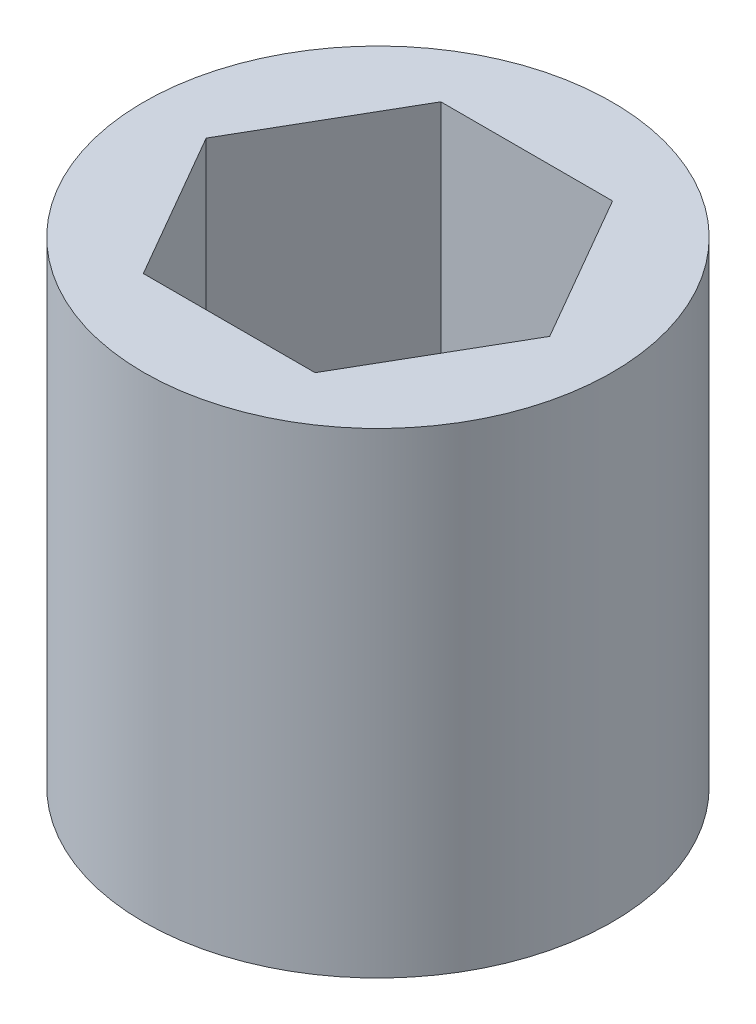
ISO-10303-21;
HEADER;
FILE_DESCRIPTION(('STEP AP214'),'2;1');
FILE_NAME('part.step','',(''),(''),'','','');
FILE_SCHEMA(('AUTOMOTIVE_DESIGN { 1 0 10303 214 1 1 1 1 }'));
ENDSEC;
DATA;
#1=APPLICATION_CONTEXT('core data for automotive mechanical design processes');
#2=APPLICATION_PROTOCOL_DEFINITION('international standard','automotive_design',2000,#1);
#3=PRODUCT_CONTEXT('',#1,'mechanical');
#4=PRODUCT('Part','Part','',(#3));
#5=PRODUCT_RELATED_PRODUCT_CATEGORY('part','',(#4));
#6=PRODUCT_DEFINITION_FORMATION('','',#4);
#7=PRODUCT_DEFINITION_CONTEXT('part definition',#1,'design');
#8=PRODUCT_DEFINITION('design','',#6,#7);
#9=PRODUCT_DEFINITION_SHAPE('','',#8);
#10=(LENGTH_UNIT() NAMED_UNIT(*) SI_UNIT(.MILLI.,.METRE.));
#11=(NAMED_UNIT(*) PLANE_ANGLE_UNIT() SI_UNIT($,.RADIAN.));
#12=(NAMED_UNIT(*) SI_UNIT($,.STERADIAN.) SOLID_ANGLE_UNIT());
#13=UNCERTAINTY_MEASURE_WITH_UNIT(LENGTH_MEASURE(1.E-05),#10,'distance_accuracy_value','');
#14=(GEOMETRIC_REPRESENTATION_CONTEXT(3) GLOBAL_UNCERTAINTY_ASSIGNED_CONTEXT((#13)) GLOBAL_UNIT_ASSIGNED_CONTEXT((#10,
#11,#12)) REPRESENTATION_CONTEXT('',''));
#15=CARTESIAN_POINT('',(0.,0.,0.));
#16=DIRECTION('',(0.,0.,1.));
#17=DIRECTION('',(1.,0.,0.));
#18=AXIS2_PLACEMENT_3D('',#15,#16,#17);
#19=CARTESIAN_POINT('',(0.,20.32,0.));
#20=DIRECTION('',(0.,1.,0.));
#21=DIRECTION('',(0.,0.,1.));
#22=AXIS2_PLACEMENT_3D('',#19,#20,#21);
#23=PLANE('',#22);
#24=CARTESIAN_POINT('',(0.,20.32,0.));
#25=DIRECTION('',(0.,1.,0.));
#26=DIRECTION('',(0.,0.,1.));
#27=AXIS2_PLACEMENT_3D('',#24,#25,#26);
#28=CIRCLE('',#27,10.);
#29=CARTESIAN_POINT('',(0.,20.32,10.));
#30=VERTEX_POINT('',#29);
#31=EDGE_CURVE('E11',#30,#30,#28,.T.);
#32=ORIENTED_EDGE('',*,*,#31,.T.);
#33=EDGE_LOOP('',(#32));
#34=FACE_BOUND('',#33,.T.);
#35=DIRECTION('',(0.5,0.,0.866025403784439));
#36=VECTOR('',#35,1.);
#37=CARTESIAN_POINT('',(-7.33234841870825,20.32,0.));
#38=LINE('',#37,#36);
#39=CARTESIAN_POINT('',(-7.33234841870825,20.32,0.));
#40=VERTEX_POINT('',#39);
#41=CARTESIAN_POINT('',(-3.66617420935413,20.32,6.35));
#42=VERTEX_POINT('',#41);
#43=EDGE_CURVE('E94',#40,#42,#38,.T.);
#44=ORIENTED_EDGE('',*,*,#43,.F.);
#45=DIRECTION('',(-0.5,0.,0.866025403784439));
#46=VECTOR('',#45,1.);
#47=CARTESIAN_POINT('',(-3.66617420935412,20.32,-6.35));
#48=LINE('',#47,#46);
#49=CARTESIAN_POINT('',(-3.66617420935412,20.32,-6.35));
#50=VERTEX_POINT('',#49);
#51=EDGE_CURVE('E86',#50,#40,#48,.T.);
#52=ORIENTED_EDGE('',*,*,#51,.F.);
#53=DIRECTION('',(-1.,0.,0.));
#54=VECTOR('',#53,1.);
#55=CARTESIAN_POINT('',(3.66617420935412,20.32,-6.35));
#56=LINE('',#55,#54);
#57=CARTESIAN_POINT('',(3.66617420935412,20.32,-6.35));
#58=VERTEX_POINT('',#57);
#59=EDGE_CURVE('E114',#58,#50,#56,.T.);
#60=ORIENTED_EDGE('',*,*,#59,.F.);
#61=DIRECTION('',(-0.5,0.,-0.866025403784439));
#62=VECTOR('',#61,1.);
#63=CARTESIAN_POINT('',(7.33234841870825,20.32,0.));
#64=LINE('',#63,#62);
#65=CARTESIAN_POINT('',(7.33234841870825,20.32,0.));
#66=VERTEX_POINT('',#65);
#67=EDGE_CURVE('E112',#66,#58,#64,.T.);
#68=ORIENTED_EDGE('',*,*,#67,.F.);
#69=DIRECTION('',(0.5,0.,-0.866025403784439));
#70=VECTOR('',#69,1.);
#71=CARTESIAN_POINT('',(3.66617420935412,20.32,6.35));
#72=LINE('',#71,#70);
#73=CARTESIAN_POINT('',(3.66617420935412,20.32,6.35));
#74=VERTEX_POINT('',#73);
#75=EDGE_CURVE('E108',#74,#66,#72,.T.);
#76=ORIENTED_EDGE('',*,*,#75,.F.);
#77=DIRECTION('',(1.,0.,0.));
#78=VECTOR('',#77,1.);
#79=CARTESIAN_POINT('',(-3.66617420935413,20.32,6.35));
#80=LINE('',#79,#78);
#81=EDGE_CURVE('E106',#42,#74,#80,.T.);
#82=ORIENTED_EDGE('',*,*,#81,.F.);
#83=EDGE_LOOP('',(#44,#52,#60,#68,#76,#82));
#84=FACE_BOUND('',#83,.T.);
#85=ADVANCED_FACE('F33',(#34,#84),#23,.T.);
#86=CARTESIAN_POINT('',(0.,0.,0.));
#87=DIRECTION('',(0.,1.,0.));
#88=DIRECTION('',(0.,0.,1.));
#89=AXIS2_PLACEMENT_3D('',#86,#87,#88);
#90=PLANE('',#89);
#91=CARTESIAN_POINT('',(0.,0.,0.));
#92=DIRECTION('',(0.,1.,0.));
#93=DIRECTION('',(0.,0.,1.));
#94=AXIS2_PLACEMENT_3D('',#91,#92,#93);
#95=CIRCLE('',#94,10.);
#96=CARTESIAN_POINT('',(0.,0.,10.));
#97=VERTEX_POINT('',#96);
#98=EDGE_CURVE('E37',#97,#97,#95,.T.);
#99=ORIENTED_EDGE('',*,*,#98,.F.);
#100=EDGE_LOOP('',(#99));
#101=FACE_BOUND('',#100,.T.);
#102=DIRECTION('',(-0.5,0.,0.866025403784439));
#103=VECTOR('',#102,1.);
#104=CARTESIAN_POINT('',(-3.66617420935412,0.,-6.35));
#105=LINE('',#104,#103);
#106=CARTESIAN_POINT('',(-3.66617420935412,0.,-6.35));
#107=VERTEX_POINT('',#106);
#108=CARTESIAN_POINT('',(-7.33234841870825,0.,0.));
#109=VERTEX_POINT('',#108);
#110=EDGE_CURVE('E56',#107,#109,#105,.T.);
#111=ORIENTED_EDGE('',*,*,#110,.T.);
#112=DIRECTION('',(0.5,0.,0.866025403784439));
#113=VECTOR('',#112,1.);
#114=CARTESIAN_POINT('',(-7.33234841870825,0.,0.));
#115=LINE('',#114,#113);
#116=CARTESIAN_POINT('',(-3.66617420935413,0.,6.35));
#117=VERTEX_POINT('',#116);
#118=EDGE_CURVE('E101',#109,#117,#115,.T.);
#119=ORIENTED_EDGE('',*,*,#118,.T.);
#120=DIRECTION('',(1.,0.,0.));
#121=VECTOR('',#120,1.);
#122=CARTESIAN_POINT('',(-3.66617420935413,0.,6.35));
#123=LINE('',#122,#121);
#124=CARTESIAN_POINT('',(3.66617420935412,0.,6.35));
#125=VERTEX_POINT('',#124);
#126=EDGE_CURVE('E118',#117,#125,#123,.T.);
#127=ORIENTED_EDGE('',*,*,#126,.T.);
#128=DIRECTION('',(0.5,0.,-0.866025403784439));
#129=VECTOR('',#128,1.);
#130=CARTESIAN_POINT('',(3.66617420935412,0.,6.35));
#131=LINE('',#130,#129);
#132=CARTESIAN_POINT('',(7.33234841870825,0.,0.));
#133=VERTEX_POINT('',#132);
#134=EDGE_CURVE('E121',#125,#133,#131,.T.);
#135=ORIENTED_EDGE('',*,*,#134,.T.);
#136=DIRECTION('',(-0.5,0.,-0.866025403784439));
#137=VECTOR('',#136,1.);
#138=CARTESIAN_POINT('',(7.33234841870825,0.,0.));
#139=LINE('',#138,#137);
#140=CARTESIAN_POINT('',(3.66617420935412,0.,-6.35));
#141=VERTEX_POINT('',#140);
#142=EDGE_CURVE('E124',#133,#141,#139,.T.);
#143=ORIENTED_EDGE('',*,*,#142,.T.);
#144=DIRECTION('',(-1.,0.,0.));
#145=VECTOR('',#144,1.);
#146=CARTESIAN_POINT('',(3.66617420935412,0.,-6.35));
#147=LINE('',#146,#145);
#148=EDGE_CURVE('E95',#141,#107,#147,.T.);
#149=ORIENTED_EDGE('',*,*,#148,.T.);
#150=EDGE_LOOP('',(#111,#119,#127,#135,#143,#149));
#151=FACE_BOUND('',#150,.T.);
#152=ADVANCED_FACE('F141',(#101,#151),#90,.F.);
#153=CARTESIAN_POINT('',(0.,20.32,0.));
#154=DIRECTION('',(0.,-1.,0.));
#155=DIRECTION('',(0.,0.,-1.));
#156=AXIS2_PLACEMENT_3D('',#153,#154,#155);
#157=CYLINDRICAL_SURFACE('',#156,10.);
#158=ORIENTED_EDGE('',*,*,#31,.F.);
#159=EDGE_LOOP('',(#158));
#160=FACE_BOUND('',#159,.T.);
#161=ORIENTED_EDGE('',*,*,#98,.T.);
#162=EDGE_LOOP('',(#161));
#163=FACE_BOUND('',#162,.T.);
#164=ADVANCED_FACE('F35',(#160,#163),#157,.T.);
#165=CARTESIAN_POINT('',(-3.66617420935412,20.32,-6.35));
#166=DIRECTION('',(0.866025403784438,0.,0.5));
#167=DIRECTION('',(0.5,0.,-0.866025403784439));
#168=AXIS2_PLACEMENT_3D('',#165,#166,#167);
#169=PLANE('',#168);
#170=ORIENTED_EDGE('',*,*,#110,.F.);
#171=DIRECTION('',(0.,-1.,0.));
#172=VECTOR('',#171,1.);
#173=CARTESIAN_POINT('',(-3.66617420935412,20.32,-6.35));
#174=LINE('',#173,#172);
#175=EDGE_CURVE('E90',#50,#107,#174,.T.);
#176=ORIENTED_EDGE('',*,*,#175,.F.);
#177=ORIENTED_EDGE('',*,*,#51,.T.);
#178=DIRECTION('',(0.,-1.,0.));
#179=VECTOR('',#178,1.);
#180=CARTESIAN_POINT('',(-7.33234841870825,20.32,0.));
#181=LINE('',#180,#179);
#182=EDGE_CURVE('E89',#40,#109,#181,.T.);
#183=ORIENTED_EDGE('',*,*,#182,.T.);
#184=EDGE_LOOP('',(#170,#176,#177,#183));
#185=FACE_BOUND('',#184,.T.);
#186=ADVANCED_FACE('F88',(#185),#169,.T.);
#187=CARTESIAN_POINT('',(-7.33234841870825,20.32,0.));
#188=DIRECTION('',(0.866025403784439,0.,-0.5));
#189=DIRECTION('',(-0.5,0.,-0.866025403784439));
#190=AXIS2_PLACEMENT_3D('',#187,#188,#189);
#191=PLANE('',#190);
#192=ORIENTED_EDGE('',*,*,#118,.F.);
#193=ORIENTED_EDGE('',*,*,#182,.F.);
#194=ORIENTED_EDGE('',*,*,#43,.T.);
#195=DIRECTION('',(0.,-1.,0.));
#196=VECTOR('',#195,1.);
#197=CARTESIAN_POINT('',(-3.66617420935413,20.32,6.35));
#198=LINE('',#197,#196);
#199=EDGE_CURVE('E102',#42,#117,#198,.T.);
#200=ORIENTED_EDGE('',*,*,#199,.T.);
#201=EDGE_LOOP('',(#192,#193,#194,#200));
#202=FACE_BOUND('',#201,.T.);
#203=ADVANCED_FACE('F98',(#202),#191,.T.);
#204=CARTESIAN_POINT('',(-3.66617420935413,20.32,6.35));
#205=DIRECTION('',(0.,0.,-1.));
#206=DIRECTION('',(-1.,0.,0.));
#207=AXIS2_PLACEMENT_3D('',#204,#205,#206);
#208=PLANE('',#207);
#209=ORIENTED_EDGE('',*,*,#126,.F.);
#210=ORIENTED_EDGE('',*,*,#199,.F.);
#211=ORIENTED_EDGE('',*,*,#81,.T.);
#212=DIRECTION('',(0.,-1.,0.));
#213=VECTOR('',#212,1.);
#214=CARTESIAN_POINT('',(3.66617420935412,20.32,6.35));
#215=LINE('',#214,#213);
#216=EDGE_CURVE('E133',#74,#125,#215,.T.);
#217=ORIENTED_EDGE('',*,*,#216,.T.);
#218=EDGE_LOOP('',(#209,#210,#211,#217));
#219=FACE_BOUND('',#218,.T.);
#220=ADVANCED_FACE('F137',(#219),#208,.T.);
#221=CARTESIAN_POINT('',(3.66617420935412,20.32,6.35));
#222=DIRECTION('',(-0.866025403784439,0.,-0.5));
#223=DIRECTION('',(-0.5,0.,0.866025403784439));
#224=AXIS2_PLACEMENT_3D('',#221,#222,#223);
#225=PLANE('',#224);
#226=ORIENTED_EDGE('',*,*,#134,.F.);
#227=ORIENTED_EDGE('',*,*,#216,.F.);
#228=ORIENTED_EDGE('',*,*,#75,.T.);
#229=DIRECTION('',(0.,-1.,0.));
#230=VECTOR('',#229,1.);
#231=CARTESIAN_POINT('',(7.33234841870825,20.32,0.));
#232=LINE('',#231,#230);
#233=EDGE_CURVE('E131',#66,#133,#232,.T.);
#234=ORIENTED_EDGE('',*,*,#233,.T.);
#235=EDGE_LOOP('',(#226,#227,#228,#234));
#236=FACE_BOUND('',#235,.T.);
#237=ADVANCED_FACE('F149',(#236),#225,.T.);
#238=CARTESIAN_POINT('',(7.33234841870825,20.32,0.));
#239=DIRECTION('',(-0.866025403784439,0.,0.5));
#240=DIRECTION('',(0.5,0.,0.866025403784439));
#241=AXIS2_PLACEMENT_3D('',#238,#239,#240);
#242=PLANE('',#241);
#243=ORIENTED_EDGE('',*,*,#142,.F.);
#244=ORIENTED_EDGE('',*,*,#233,.F.);
#245=ORIENTED_EDGE('',*,*,#67,.T.);
#246=DIRECTION('',(0.,-1.,0.));
#247=VECTOR('',#246,1.);
#248=CARTESIAN_POINT('',(3.66617420935412,20.32,-6.35));
#249=LINE('',#248,#247);
#250=EDGE_CURVE('E48',#58,#141,#249,.T.);
#251=ORIENTED_EDGE('',*,*,#250,.T.);
#252=EDGE_LOOP('',(#243,#244,#245,#251));
#253=FACE_BOUND('',#252,.T.);
#254=ADVANCED_FACE('F147',(#253),#242,.T.);
#255=CARTESIAN_POINT('',(3.66617420935412,20.32,-6.35));
#256=DIRECTION('',(0.,0.,1.));
#257=DIRECTION('',(1.,0.,0.));
#258=AXIS2_PLACEMENT_3D('',#255,#256,#257);
#259=PLANE('',#258);
#260=ORIENTED_EDGE('',*,*,#148,.F.);
#261=ORIENTED_EDGE('',*,*,#250,.F.);
#262=ORIENTED_EDGE('',*,*,#59,.T.);
#263=ORIENTED_EDGE('',*,*,#175,.T.);
#264=EDGE_LOOP('',(#260,#261,#262,#263));
#265=FACE_BOUND('',#264,.T.);
#266=ADVANCED_FACE('F143',(#265),#259,.T.);
#267=CLOSED_SHELL('',(#85,#152,#164,#186,#203,#220,#237,#254,#266));
#268=MANIFOLD_SOLID_BREP('B2',#267);
#269=ADVANCED_BREP_SHAPE_REPRESENTATION('',(#18,#268),#14);
#270=SHAPE_DEFINITION_REPRESENTATION(#9,#269);
ENDSEC;
END-ISO-10303-21;
